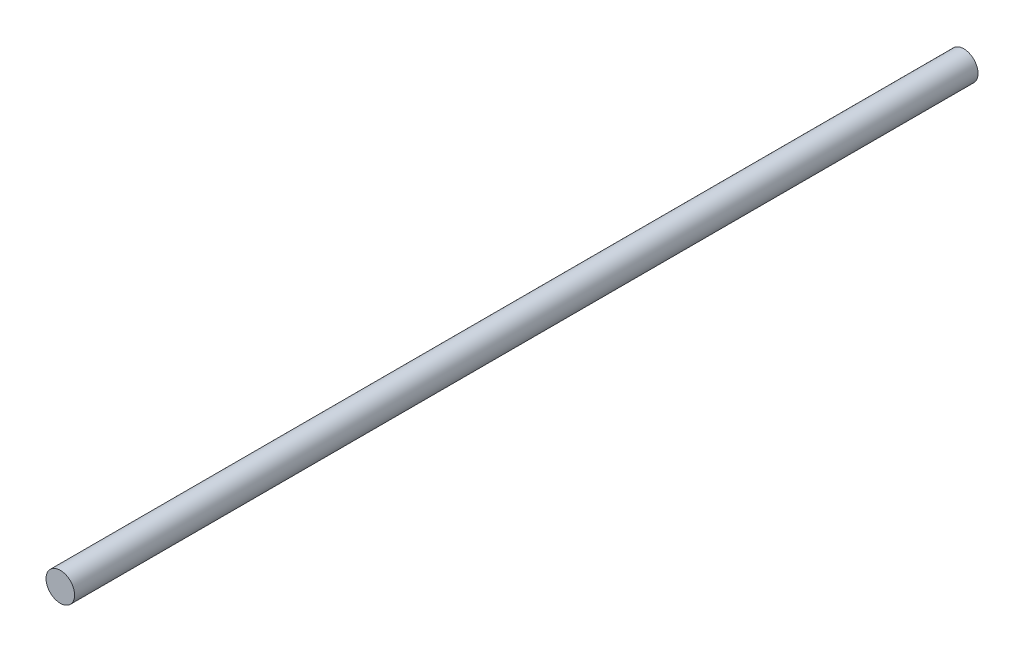
ISO-10303-21;
HEADER;
FILE_DESCRIPTION(('STEP AP214'),'2;1');
FILE_NAME('part.step','',(''),(''),'','','');
FILE_SCHEMA(('AUTOMOTIVE_DESIGN { 1 0 10303 214 1 1 1 1 }'));
ENDSEC;
DATA;
#1=APPLICATION_CONTEXT('core data for automotive mechanical design processes');
#2=APPLICATION_PROTOCOL_DEFINITION('international standard','automotive_design',2000,#1);
#3=PRODUCT_CONTEXT('',#1,'mechanical');
#4=PRODUCT('Part','Part','',(#3));
#5=PRODUCT_RELATED_PRODUCT_CATEGORY('part','',(#4));
#6=PRODUCT_DEFINITION_FORMATION('','',#4);
#7=PRODUCT_DEFINITION_CONTEXT('part definition',#1,'design');
#8=PRODUCT_DEFINITION('design','',#6,#7);
#9=PRODUCT_DEFINITION_SHAPE('','',#8);
#10=(LENGTH_UNIT() NAMED_UNIT(*) SI_UNIT(.MILLI.,.METRE.));
#11=(NAMED_UNIT(*) PLANE_ANGLE_UNIT() SI_UNIT($,.RADIAN.));
#12=(NAMED_UNIT(*) SI_UNIT($,.STERADIAN.) SOLID_ANGLE_UNIT());
#13=UNCERTAINTY_MEASURE_WITH_UNIT(LENGTH_MEASURE(1.E-05),#10,'distance_accuracy_value','');
#14=(GEOMETRIC_REPRESENTATION_CONTEXT(3) GLOBAL_UNCERTAINTY_ASSIGNED_CONTEXT((#13)) GLOBAL_UNIT_ASSIGNED_CONTEXT((#10,
#11,#12)) REPRESENTATION_CONTEXT('',''));
#15=CARTESIAN_POINT('',(0.,0.,0.));
#16=DIRECTION('',(0.,0.,1.));
#17=DIRECTION('',(1.,0.,0.));
#18=AXIS2_PLACEMENT_3D('',#15,#16,#17);
#19=CARTESIAN_POINT('',(0.,0.,152.4));
#20=DIRECTION('',(0.,0.,-1.));
#21=DIRECTION('',(-1.,0.,0.));
#22=AXIS2_PLACEMENT_3D('',#19,#20,#21);
#23=CYLINDRICAL_SURFACE('',#22,2.413);
#24=CARTESIAN_POINT('',(0.,0.,152.4));
#25=DIRECTION('',(0.,0.,1.));
#26=DIRECTION('',(1.,0.,0.));
#27=AXIS2_PLACEMENT_3D('',#24,#25,#26);
#28=CIRCLE('',#27,2.413);
#29=CARTESIAN_POINT('',(-2.413,0.,152.4));
#30=VERTEX_POINT('',#29);
#31=EDGE_CURVE('E10',#30,#30,#28,.T.);
#32=CARTESIAN_POINT('',(0.,0.,0.));
#33=DIRECTION('',(0.,0.,1.));
#34=DIRECTION('',(1.,0.,0.));
#35=AXIS2_PLACEMENT_3D('',#32,#33,#34);
#36=CIRCLE('',#35,2.413);
#37=CARTESIAN_POINT('',(-2.413,0.,0.));
#38=VERTEX_POINT('',#37);
#39=EDGE_CURVE('E34',#38,#38,#36,.T.);
#40=CARTESIAN_POINT('',(-2.413,0.,152.4));
#41=CARTESIAN_POINT('',(-2.413,0.,150.8125));
#42=CARTESIAN_POINT('',(-2.413,0.,149.225));
#43=CARTESIAN_POINT('',(-2.413,0.,146.05));
#44=CARTESIAN_POINT('',(-2.413,0.,144.4625));
#45=CARTESIAN_POINT('',(-2.413,0.,141.2875));
#46=CARTESIAN_POINT('',(-2.413,0.,139.7));
#47=CARTESIAN_POINT('',(-2.413,0.,136.525));
#48=CARTESIAN_POINT('',(-2.413,0.,134.9375));
#49=CARTESIAN_POINT('',(-2.413,0.,131.7625));
#50=CARTESIAN_POINT('',(-2.413,0.,130.175));
#51=CARTESIAN_POINT('',(-2.413,0.,127.));
#52=CARTESIAN_POINT('',(-2.413,0.,125.4125));
#53=CARTESIAN_POINT('',(-2.413,0.,122.2375));
#54=CARTESIAN_POINT('',(-2.413,0.,120.65));
#55=CARTESIAN_POINT('',(-2.413,0.,117.475));
#56=CARTESIAN_POINT('',(-2.413,0.,115.8875));
#57=CARTESIAN_POINT('',(-2.413,0.,112.7125));
#58=CARTESIAN_POINT('',(-2.413,0.,111.125));
#59=CARTESIAN_POINT('',(-2.413,0.,107.95));
#60=CARTESIAN_POINT('',(-2.413,0.,106.3625));
#61=CARTESIAN_POINT('',(-2.413,0.,103.1875));
#62=CARTESIAN_POINT('',(-2.413,0.,101.6));
#63=CARTESIAN_POINT('',(-2.413,0.,98.425));
#64=CARTESIAN_POINT('',(-2.413,0.,96.8375));
#65=CARTESIAN_POINT('',(-2.413,0.,93.6625));
#66=CARTESIAN_POINT('',(-2.413,0.,92.075));
#67=CARTESIAN_POINT('',(-2.413,0.,88.9));
#68=CARTESIAN_POINT('',(-2.413,0.,87.3125));
#69=CARTESIAN_POINT('',(-2.413,0.,84.1375));
#70=CARTESIAN_POINT('',(-2.413,0.,82.55));
#71=CARTESIAN_POINT('',(-2.413,0.,79.375));
#72=CARTESIAN_POINT('',(-2.413,0.,77.7875));
#73=CARTESIAN_POINT('',(-2.413,0.,74.6125));
#74=CARTESIAN_POINT('',(-2.413,0.,73.025));
#75=CARTESIAN_POINT('',(-2.413,0.,69.85));
#76=CARTESIAN_POINT('',(-2.413,0.,68.2625));
#77=CARTESIAN_POINT('',(-2.413,0.,65.0875));
#78=CARTESIAN_POINT('',(-2.413,0.,63.5));
#79=CARTESIAN_POINT('',(-2.413,0.,60.325));
#80=CARTESIAN_POINT('',(-2.413,0.,58.7375));
#81=CARTESIAN_POINT('',(-2.413,0.,55.5625));
#82=CARTESIAN_POINT('',(-2.413,0.,53.975));
#83=CARTESIAN_POINT('',(-2.413,0.,50.8));
#84=CARTESIAN_POINT('',(-2.413,0.,49.2125));
#85=CARTESIAN_POINT('',(-2.413,0.,46.0375));
#86=CARTESIAN_POINT('',(-2.413,0.,44.45));
#87=CARTESIAN_POINT('',(-2.413,0.,41.275));
#88=CARTESIAN_POINT('',(-2.413,0.,39.6875));
#89=CARTESIAN_POINT('',(-2.413,0.,36.5125));
#90=CARTESIAN_POINT('',(-2.413,0.,34.925));
#91=CARTESIAN_POINT('',(-2.413,0.,31.75));
#92=CARTESIAN_POINT('',(-2.413,0.,30.1625));
#93=CARTESIAN_POINT('',(-2.413,0.,26.9875));
#94=CARTESIAN_POINT('',(-2.413,0.,25.4));
#95=CARTESIAN_POINT('',(-2.413,0.,22.225));
#96=CARTESIAN_POINT('',(-2.413,0.,20.6375));
#97=CARTESIAN_POINT('',(-2.413,0.,17.4625));
#98=CARTESIAN_POINT('',(-2.413,0.,15.875));
#99=CARTESIAN_POINT('',(-2.413,0.,12.7));
#100=CARTESIAN_POINT('',(-2.413,0.,11.1125));
#101=CARTESIAN_POINT('',(-2.413,0.,7.93750000000001));
#102=CARTESIAN_POINT('',(-2.413,0.,6.35));
#103=CARTESIAN_POINT('',(-2.413,0.,3.175));
#104=CARTESIAN_POINT('',(-2.413,0.,1.5875));
#105=CARTESIAN_POINT('',(-2.413,0.,0.));
#106=B_SPLINE_CURVE_WITH_KNOTS('',3,(#40,#41,#42,#43,#44,#45,#46,#47,#48,#49,#50,#51,#52,#53,
#54,#55,#56,#57,#58,#59,#60,#61,#62,#63,#64,#65,#66,#67,#68,#69,#70,#71,#72,#73,#74,#75,#76,#77,
#78,#79,#80,#81,#82,#83,#84,#85,#86,#87,#88,#89,#90,#91,#92,#93,#94,#95,#96,#97,#98,#99,#100,
#101,#102,#103,#104,#105),.UNSPECIFIED.,.F.,.F.,(4,2,2,2,2,2,2,2,2,2,2,2,2,2,2,2,2,2,2,2,2,2,2,
2,2,2,2,2,2,2,2,2,4),(0.,4.7625,9.52500000000001,14.2875,19.05,23.8125,28.575,33.3375,38.1,
42.8625,47.625,52.3875,57.15,61.9125,66.675,71.4375,76.2,80.9625,85.725,90.4875,95.25,100.0125,
104.775,109.5375,114.3,119.0625,123.825,128.5875,133.35,138.1125,142.875,147.6375,152.4),.UNSPECIFIED.);
#107=EDGE_CURVE('BSEAM31',#30,#38,#106,.T.);
#108=ORIENTED_EDGE('',*,*,#31,.F.);
#109=ORIENTED_EDGE('',*,*,#39,.T.);
#110=ORIENTED_EDGE('',*,*,#107,.T.);
#111=ORIENTED_EDGE('',*,*,#107,.F.);
#112=EDGE_LOOP('',(#108,#110,#109,#111));
#113=FACE_BOUND('',#112,.T.);
#114=ADVANCED_FACE('F31',(#113),#23,.T.);
#115=CARTESIAN_POINT('',(0.,0.,152.4));
#116=DIRECTION('',(0.,0.,1.));
#117=DIRECTION('',(1.,0.,0.));
#118=AXIS2_PLACEMENT_3D('',#115,#116,#117);
#119=PLANE('',#118);
#120=ORIENTED_EDGE('',*,*,#31,.T.);
#121=EDGE_LOOP('',(#120));
#122=FACE_BOUND('',#121,.T.);
#123=ADVANCED_FACE('F46',(#122),#119,.T.);
#124=CARTESIAN_POINT('',(0.,0.,0.));
#125=DIRECTION('',(0.,0.,1.));
#126=DIRECTION('',(1.,0.,0.));
#127=AXIS2_PLACEMENT_3D('',#124,#125,#126);
#128=PLANE('',#127);
#129=ORIENTED_EDGE('',*,*,#39,.F.);
#130=EDGE_LOOP('',(#129));
#131=FACE_BOUND('',#130,.T.);
#132=ADVANCED_FACE('F44',(#131),#128,.F.);
#133=CLOSED_SHELL('',(#114,#123,#132));
#134=MANIFOLD_SOLID_BREP('B2',#133);
#135=ADVANCED_BREP_SHAPE_REPRESENTATION('',(#18,#134),#14);
#136=SHAPE_DEFINITION_REPRESENTATION(#9,#135);
ENDSEC;
END-ISO-10303-21;
